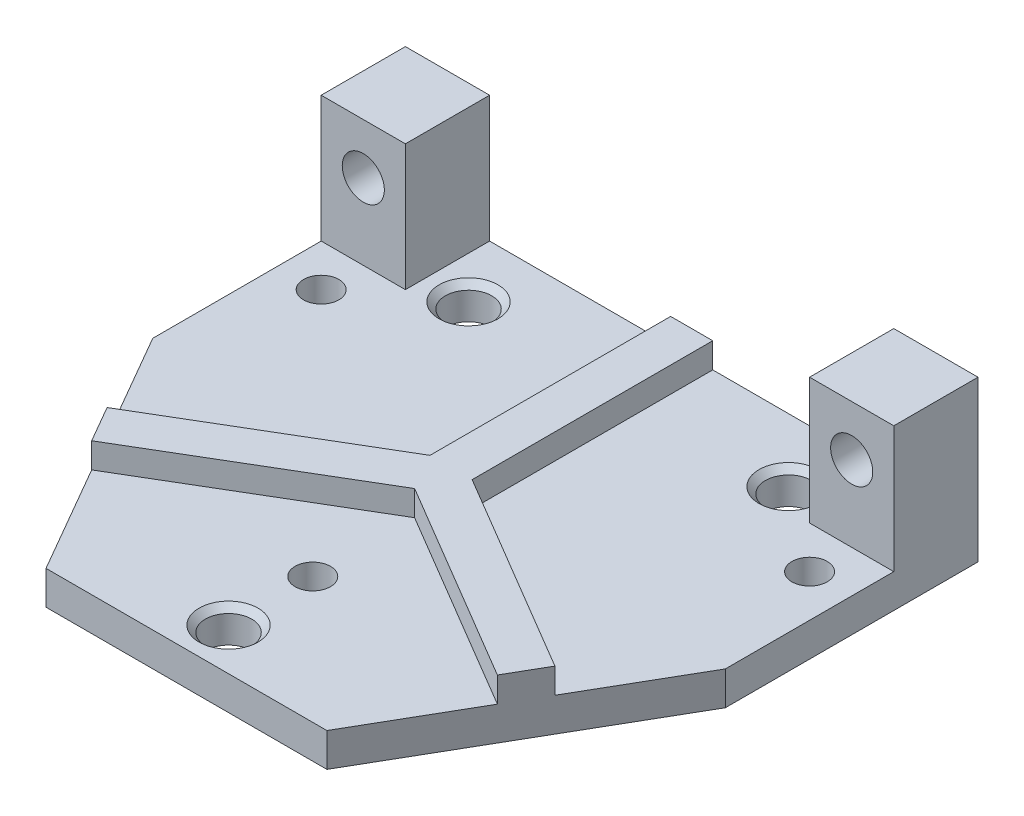
ISO-10303-21;
HEADER;
FILE_DESCRIPTION(('STEP AP214'),'2;1');
FILE_NAME('part.step','',(''),(''),'','','');
FILE_SCHEMA(('AUTOMOTIVE_DESIGN { 1 0 10303 214 1 1 1 1 }'));
ENDSEC;
DATA;
#1=APPLICATION_CONTEXT('core data for automotive mechanical design processes');
#2=APPLICATION_PROTOCOL_DEFINITION('international standard','automotive_design',2000,#1);
#3=PRODUCT_CONTEXT('',#1,'mechanical');
#4=PRODUCT('Part','Part','',(#3));
#5=PRODUCT_RELATED_PRODUCT_CATEGORY('part','',(#4));
#6=PRODUCT_DEFINITION_FORMATION('','',#4);
#7=PRODUCT_DEFINITION_CONTEXT('part definition',#1,'design');
#8=PRODUCT_DEFINITION('design','',#6,#7);
#9=PRODUCT_DEFINITION_SHAPE('','',#8);
#10=(LENGTH_UNIT() NAMED_UNIT(*) SI_UNIT(.MILLI.,.METRE.));
#11=(NAMED_UNIT(*) PLANE_ANGLE_UNIT() SI_UNIT($,.RADIAN.));
#12=(NAMED_UNIT(*) SI_UNIT($,.STERADIAN.) SOLID_ANGLE_UNIT());
#13=UNCERTAINTY_MEASURE_WITH_UNIT(LENGTH_MEASURE(1.E-05),#10,'distance_accuracy_value','');
#14=(GEOMETRIC_REPRESENTATION_CONTEXT(3) GLOBAL_UNCERTAINTY_ASSIGNED_CONTEXT((#13)) GLOBAL_UNIT_ASSIGNED_CONTEXT((#10,
#11,#12)) REPRESENTATION_CONTEXT('',''));
#15=CARTESIAN_POINT('',(0.,0.,0.));
#16=DIRECTION('',(0.,0.,1.));
#17=DIRECTION('',(1.,0.,0.));
#18=AXIS2_PLACEMENT_3D('',#15,#16,#17);
#19=CARTESIAN_POINT('',(0.,4.,0.));
#20=DIRECTION('',(0.,-1.,0.));
#21=DIRECTION('',(0.,0.,-1.));
#22=AXIS2_PLACEMENT_3D('',#19,#20,#21);
#23=PLANE('',#22);
#24=CARTESIAN_POINT('',(19.,4.,-22.5));
#25=DIRECTION('',(0.,-1.,0.));
#26=DIRECTION('',(0.,0.,-1.));
#27=AXIS2_PLACEMENT_3D('',#24,#25,#26);
#28=CIRCLE('',#27,3.5);
#29=CARTESIAN_POINT('',(19.,4.,-26.));
#30=VERTEX_POINT('',#29);
#31=EDGE_CURVE('E11',#30,#30,#28,.T.);
#32=ORIENTED_EDGE('',*,*,#31,.T.);
#33=EDGE_LOOP('',(#32));
#34=FACE_BOUND('',#33,.T.);
#35=CARTESIAN_POINT('',(29.,4.,-15.));
#36=DIRECTION('',(0.,1.,0.));
#37=DIRECTION('',(0.,0.,1.));
#38=AXIS2_PLACEMENT_3D('',#35,#36,#37);
#39=CIRCLE('',#38,2.1);
#40=CARTESIAN_POINT('',(29.,4.,-12.9));
#41=VERTEX_POINT('',#40);
#42=EDGE_CURVE('E314',#41,#41,#39,.T.);
#43=ORIENTED_EDGE('',*,*,#42,.F.);
#44=EDGE_LOOP('',(#43));
#45=FACE_BOUND('',#44,.T.);
#46=DIRECTION('',(0.,0.,1.));
#47=VECTOR('',#46,1.);
#48=CARTESIAN_POINT('',(23.9999999999999,4.,-30.));
#49=LINE('',#48,#47);
#50=CARTESIAN_POINT('',(23.9999999999999,4.,-30.));
#51=VERTEX_POINT('',#50);
#52=CARTESIAN_POINT('',(23.9999999999999,4.,-20.));
#53=VERTEX_POINT('',#52);
#54=EDGE_CURVE('E202',#51,#53,#49,.T.);
#55=ORIENTED_EDGE('',*,*,#54,.F.);
#56=DIRECTION('',(-1.,0.,0.));
#57=VECTOR('',#56,1.);
#58=CARTESIAN_POINT('',(-34.,4.,-30.));
#59=LINE('',#58,#57);
#60=CARTESIAN_POINT('',(2.5,4.,-30.));
#61=VERTEX_POINT('',#60);
#62=EDGE_CURVE('E337',#51,#61,#59,.T.);
#63=ORIENTED_EDGE('',*,*,#62,.T.);
#64=DIRECTION('',(0.,0.,-1.));
#65=VECTOR('',#64,1.);
#66=CARTESIAN_POINT('',(2.5,4.,-1.4252913257079));
#67=LINE('',#66,#65);
#68=CARTESIAN_POINT('',(2.5,4.,-1.4252913257079));
#69=VERTEX_POINT('',#68);
#70=EDGE_CURVE('E276',#69,#61,#67,.T.);
#71=ORIENTED_EDGE('',*,*,#70,.F.);
#72=DIRECTION('',(-0.860531913298751,0.,-0.509396531392186));
#73=VECTOR('',#72,1.);
#74=CARTESIAN_POINT('',(2.5,4.,-1.4252913257079));
#75=LINE('',#74,#73);
#76=CARTESIAN_POINT('',(26.5898200123171,4.,12.834808231897));
#77=VERTEX_POINT('',#76);
#78=EDGE_CURVE('E273',#77,#69,#75,.T.);
#79=ORIENTED_EDGE('',*,*,#78,.F.);
#80=DIRECTION('',(0.499999999999997,0.,-0.86602540378444));
#81=VECTOR('',#80,1.);
#82=CARTESIAN_POINT('',(16.6794919243114,4.,30.));
#83=LINE('',#82,#81);
#84=CARTESIAN_POINT('',(34.,4.,0.));
#85=VERTEX_POINT('',#84);
#86=EDGE_CURVE('E346',#77,#85,#83,.T.);
#87=ORIENTED_EDGE('',*,*,#86,.T.);
#88=DIRECTION('',(0.,0.,-1.));
#89=VECTOR('',#88,1.);
#90=CARTESIAN_POINT('',(34.,4.,0.));
#91=LINE('',#90,#89);
#92=CARTESIAN_POINT('',(34.,4.,-20.));
#93=VERTEX_POINT('',#92);
#94=EDGE_CURVE('E52',#85,#93,#91,.T.);
#95=ORIENTED_EDGE('',*,*,#94,.T.);
#96=DIRECTION('',(1.,0.,0.));
#97=VECTOR('',#96,1.);
#98=CARTESIAN_POINT('',(34.,4.,-20.));
#99=LINE('',#98,#97);
#100=EDGE_CURVE('E47',#53,#93,#99,.T.);
#101=ORIENTED_EDGE('',*,*,#100,.F.);
#102=EDGE_LOOP('',(#55,#63,#71,#79,#87,#95,#101));
#103=FACE_BOUND('',#102,.T.);
#104=ADVANCED_FACE('F32',(#34,#45,#103),#23,.F.);
#105=CARTESIAN_POINT('',(-19.,4.,-22.5));
#106=DIRECTION('',(0.,-1.,0.));
#107=DIRECTION('',(0.,0.,-1.));
#108=AXIS2_PLACEMENT_3D('',#105,#106,#107);
#109=CIRCLE('',#108,3.5);
#110=CARTESIAN_POINT('',(-19.,4.,-26.));
#111=VERTEX_POINT('',#110);
#112=EDGE_CURVE('E386',#111,#111,#109,.T.);
#113=ORIENTED_EDGE('',*,*,#112,.T.);
#114=EDGE_LOOP('',(#113));
#115=FACE_BOUND('',#114,.T.);
#116=CARTESIAN_POINT('',(-29.,4.,-15.));
#117=DIRECTION('',(0.,1.,0.));
#118=DIRECTION('',(0.,0.,1.));
#119=AXIS2_PLACEMENT_3D('',#116,#117,#118);
#120=CIRCLE('',#119,2.1);
#121=CARTESIAN_POINT('',(-29.,4.,-12.9));
#122=VERTEX_POINT('',#121);
#123=EDGE_CURVE('E320',#122,#122,#120,.T.);
#124=ORIENTED_EDGE('',*,*,#123,.F.);
#125=EDGE_LOOP('',(#124));
#126=FACE_BOUND('',#125,.T.);
#127=DIRECTION('',(1.,0.,0.));
#128=VECTOR('',#127,1.);
#129=CARTESIAN_POINT('',(-34.,4.,-20.));
#130=LINE('',#129,#128);
#131=CARTESIAN_POINT('',(-34.,4.,-20.));
#132=VERTEX_POINT('',#131);
#133=CARTESIAN_POINT('',(-24.,4.,-20.));
#134=VERTEX_POINT('',#133);
#135=EDGE_CURVE('E218',#132,#134,#130,.T.);
#136=ORIENTED_EDGE('',*,*,#135,.F.);
#137=DIRECTION('',(0.,0.,1.));
#138=VECTOR('',#137,1.);
#139=CARTESIAN_POINT('',(-34.,4.,0.));
#140=LINE('',#139,#138);
#141=CARTESIAN_POINT('',(-34.,4.,0.));
#142=VERTEX_POINT('',#141);
#143=EDGE_CURVE('E339',#132,#142,#140,.T.);
#144=ORIENTED_EDGE('',*,*,#143,.T.);
#145=DIRECTION('',(0.499999999999999,0.,0.866025403784439));
#146=VECTOR('',#145,1.);
#147=CARTESIAN_POINT('',(-34.,4.,0.));
#148=LINE('',#147,#146);
#149=CARTESIAN_POINT('',(-26.5898200123171,4.,12.834808231897));
#150=VERTEX_POINT('',#149);
#151=EDGE_CURVE('E342',#142,#150,#148,.T.);
#152=ORIENTED_EDGE('',*,*,#151,.T.);
#153=DIRECTION('',(-0.860531913298751,0.,0.509396531392187));
#154=VECTOR('',#153,1.);
#155=CARTESIAN_POINT('',(-26.5898200123171,4.,12.834808231897));
#156=LINE('',#155,#154);
#157=CARTESIAN_POINT('',(-2.5,4.,-1.4252913257079));
#158=VERTEX_POINT('',#157);
#159=EDGE_CURVE('E243',#158,#150,#156,.T.);
#160=ORIENTED_EDGE('',*,*,#159,.F.);
#161=DIRECTION('',(0.,0.,1.));
#162=VECTOR('',#161,1.);
#163=CARTESIAN_POINT('',(-2.5,4.,-1.4252913257079));
#164=LINE('',#163,#162);
#165=CARTESIAN_POINT('',(-2.5,4.,-30.));
#166=VERTEX_POINT('',#165);
#167=EDGE_CURVE('E248',#166,#158,#164,.T.);
#168=ORIENTED_EDGE('',*,*,#167,.F.);
#169=CARTESIAN_POINT('',(-24.,4.,-30.));
#170=VERTEX_POINT('',#169);
#171=EDGE_CURVE('E335',#166,#170,#59,.T.);
#172=ORIENTED_EDGE('',*,*,#171,.T.);
#173=DIRECTION('',(0.,0.,-1.));
#174=VECTOR('',#173,1.);
#175=CARTESIAN_POINT('',(-24.,4.,-30.));
#176=LINE('',#175,#174);
#177=EDGE_CURVE('E223',#134,#170,#176,.T.);
#178=ORIENTED_EDGE('',*,*,#177,.F.);
#179=EDGE_LOOP('',(#136,#144,#152,#160,#168,#172,#178));
#180=FACE_BOUND('',#179,.T.);
#181=ADVANCED_FACE('F404',(#115,#126,#180),#23,.F.);
#182=CARTESIAN_POINT('',(0.,4.,25.));
#183=DIRECTION('',(0.,-1.,0.));
#184=DIRECTION('',(0.,0.,-1.));
#185=AXIS2_PLACEMENT_3D('',#182,#183,#184);
#186=CIRCLE('',#185,3.5);
#187=CARTESIAN_POINT('',(0.,4.,21.5));
#188=VERTEX_POINT('',#187);
#189=EDGE_CURVE('E380',#188,#188,#186,.T.);
#190=ORIENTED_EDGE('',*,*,#189,.T.);
#191=EDGE_LOOP('',(#190));
#192=FACE_BOUND('',#191,.T.);
#193=CARTESIAN_POINT('',(0.,4.,15.));
#194=DIRECTION('',(0.,1.,0.));
#195=DIRECTION('',(0.,0.,1.));
#196=AXIS2_PLACEMENT_3D('',#193,#194,#195);
#197=CIRCLE('',#196,2.1);
#198=CARTESIAN_POINT('',(0.,4.,17.1));
#199=VERTEX_POINT('',#198);
#200=EDGE_CURVE('E308',#199,#199,#197,.T.);
#201=ORIENTED_EDGE('',*,*,#200,.F.);
#202=EDGE_LOOP('',(#201));
#203=FACE_BOUND('',#202,.T.);
#204=DIRECTION('',(0.860531913298751,0.,0.509396531392186));
#205=VECTOR('',#204,1.);
#206=CARTESIAN_POINT('',(0.,4.,2.90517987928714));
#207=LINE('',#206,#205);
#208=CARTESIAN_POINT('',(0.,4.,2.90517987928714));
#209=VERTEX_POINT('',#208);
#210=CARTESIAN_POINT('',(24.0896719119943,4.,17.165191768103));
#211=VERTEX_POINT('',#210);
#212=EDGE_CURVE('E270',#209,#211,#207,.T.);
#213=ORIENTED_EDGE('',*,*,#212,.F.);
#214=DIRECTION('',(0.86053191329875,0.,-0.509396531392187));
#215=VECTOR('',#214,1.);
#216=CARTESIAN_POINT('',(-24.0896719119942,4.,17.165191768103));
#217=LINE('',#216,#215);
#218=CARTESIAN_POINT('',(-24.0896719119942,4.,17.165191768103));
#219=VERTEX_POINT('',#218);
#220=EDGE_CURVE('E267',#219,#209,#217,.T.);
#221=ORIENTED_EDGE('',*,*,#220,.F.);
#222=CARTESIAN_POINT('',(-16.6794919243113,4.,30.));
#223=VERTEX_POINT('',#222);
#224=EDGE_CURVE('E341',#219,#223,#148,.T.);
#225=ORIENTED_EDGE('',*,*,#224,.T.);
#226=DIRECTION('',(1.,0.,0.));
#227=VECTOR('',#226,1.);
#228=CARTESIAN_POINT('',(-16.6794919243113,4.,30.));
#229=LINE('',#228,#227);
#230=CARTESIAN_POINT('',(16.6794919243114,4.,30.));
#231=VERTEX_POINT('',#230);
#232=EDGE_CURVE('E344',#223,#231,#229,.T.);
#233=ORIENTED_EDGE('',*,*,#232,.T.);
#234=EDGE_CURVE('E347',#231,#211,#83,.T.);
#235=ORIENTED_EDGE('',*,*,#234,.T.);
#236=EDGE_LOOP('',(#213,#221,#225,#233,#235));
#237=FACE_BOUND('',#236,.T.);
#238=ADVANCED_FACE('F407',(#192,#203,#237),#23,.F.);
#239=CARTESIAN_POINT('',(0.,0.,0.));
#240=DIRECTION('',(0.,-1.,0.));
#241=DIRECTION('',(0.,0.,-1.));
#242=AXIS2_PLACEMENT_3D('',#239,#240,#241);
#243=PLANE('',#242);
#244=CARTESIAN_POINT('',(29.,0.,-15.));
#245=DIRECTION('',(0.,1.,0.));
#246=DIRECTION('',(0.,0.,1.));
#247=AXIS2_PLACEMENT_3D('',#244,#245,#246);
#248=CIRCLE('',#247,2.1);
#249=CARTESIAN_POINT('',(29.,0.,-12.9));
#250=VERTEX_POINT('',#249);
#251=EDGE_CURVE('E311',#250,#250,#248,.T.);
#252=ORIENTED_EDGE('',*,*,#251,.T.);
#253=EDGE_LOOP('',(#252));
#254=FACE_BOUND('',#253,.T.);
#255=CARTESIAN_POINT('',(0.,0.,25.));
#256=DIRECTION('',(0.,1.,0.));
#257=DIRECTION('',(0.,0.,1.));
#258=AXIS2_PLACEMENT_3D('',#255,#256,#257);
#259=CIRCLE('',#258,2.75);
#260=CARTESIAN_POINT('',(0.,0.,27.75));
#261=VERTEX_POINT('',#260);
#262=EDGE_CURVE('E323',#261,#261,#259,.T.);
#263=ORIENTED_EDGE('',*,*,#262,.T.);
#264=EDGE_LOOP('',(#263));
#265=FACE_BOUND('',#264,.T.);
#266=CARTESIAN_POINT('',(-19.,0.,-22.5));
#267=DIRECTION('',(0.,1.,0.));
#268=DIRECTION('',(0.,0.,1.));
#269=AXIS2_PLACEMENT_3D('',#266,#267,#268);
#270=CIRCLE('',#269,2.75);
#271=CARTESIAN_POINT('',(-19.,0.,-19.75));
#272=VERTEX_POINT('',#271);
#273=EDGE_CURVE('E331',#272,#272,#270,.T.);
#274=ORIENTED_EDGE('',*,*,#273,.T.);
#275=EDGE_LOOP('',(#274));
#276=FACE_BOUND('',#275,.T.);
#277=DIRECTION('',(0.,0.,-1.));
#278=VECTOR('',#277,1.);
#279=CARTESIAN_POINT('',(34.,0.,0.));
#280=LINE('',#279,#278);
#281=CARTESIAN_POINT('',(34.,0.,0.));
#282=VERTEX_POINT('',#281);
#283=CARTESIAN_POINT('',(34.,0.,-30.));
#284=VERTEX_POINT('',#283);
#285=EDGE_CURVE('E183',#282,#284,#280,.T.);
#286=ORIENTED_EDGE('',*,*,#285,.F.);
#287=DIRECTION('',(0.499999999999997,0.,-0.86602540378444));
#288=VECTOR('',#287,1.);
#289=CARTESIAN_POINT('',(16.6794919243114,0.,30.));
#290=LINE('',#289,#288);
#291=CARTESIAN_POINT('',(16.6794919243114,0.,30.));
#292=VERTEX_POINT('',#291);
#293=EDGE_CURVE('E336',#292,#282,#290,.T.);
#294=ORIENTED_EDGE('',*,*,#293,.F.);
#295=DIRECTION('',(1.,0.,0.));
#296=VECTOR('',#295,1.);
#297=CARTESIAN_POINT('',(-16.6794919243113,0.,30.));
#298=LINE('',#297,#296);
#299=CARTESIAN_POINT('',(-16.6794919243113,0.,30.));
#300=VERTEX_POINT('',#299);
#301=EDGE_CURVE('E357',#300,#292,#298,.T.);
#302=ORIENTED_EDGE('',*,*,#301,.F.);
#303=DIRECTION('',(0.499999999999999,0.,0.866025403784439));
#304=VECTOR('',#303,1.);
#305=CARTESIAN_POINT('',(-34.,0.,0.));
#306=LINE('',#305,#304);
#307=CARTESIAN_POINT('',(-34.,0.,0.));
#308=VERTEX_POINT('',#307);
#309=EDGE_CURVE('E355',#308,#300,#306,.T.);
#310=ORIENTED_EDGE('',*,*,#309,.F.);
#311=DIRECTION('',(0.,0.,1.));
#312=VECTOR('',#311,1.);
#313=CARTESIAN_POINT('',(-34.,0.,0.));
#314=LINE('',#313,#312);
#315=CARTESIAN_POINT('',(-34.,0.,-30.));
#316=VERTEX_POINT('',#315);
#317=EDGE_CURVE('E353',#316,#308,#314,.T.);
#318=ORIENTED_EDGE('',*,*,#317,.F.);
#319=DIRECTION('',(-1.,0.,0.));
#320=VECTOR('',#319,1.);
#321=CARTESIAN_POINT('',(-34.,0.,-30.));
#322=LINE('',#321,#320);
#323=EDGE_CURVE('E351',#284,#316,#322,.T.);
#324=ORIENTED_EDGE('',*,*,#323,.F.);
#325=EDGE_LOOP('',(#286,#294,#302,#310,#318,#324));
#326=FACE_BOUND('',#325,.T.);
#327=CARTESIAN_POINT('',(19.,0.,-22.5));
#328=DIRECTION('',(0.,1.,0.));
#329=DIRECTION('',(0.,0.,1.));
#330=AXIS2_PLACEMENT_3D('',#327,#328,#329);
#331=CIRCLE('',#330,2.75);
#332=CARTESIAN_POINT('',(19.,0.,-19.75));
#333=VERTEX_POINT('',#332);
#334=EDGE_CURVE('E328',#333,#333,#331,.T.);
#335=ORIENTED_EDGE('',*,*,#334,.T.);
#336=EDGE_LOOP('',(#335));
#337=FACE_BOUND('',#336,.T.);
#338=CARTESIAN_POINT('',(-29.,0.,-15.));
#339=DIRECTION('',(0.,1.,0.));
#340=DIRECTION('',(0.,0.,1.));
#341=AXIS2_PLACEMENT_3D('',#338,#339,#340);
#342=CIRCLE('',#341,2.1);
#343=CARTESIAN_POINT('',(-29.,0.,-12.9));
#344=VERTEX_POINT('',#343);
#345=EDGE_CURVE('E317',#344,#344,#342,.T.);
#346=ORIENTED_EDGE('',*,*,#345,.T.);
#347=EDGE_LOOP('',(#346));
#348=FACE_BOUND('',#347,.T.);
#349=CARTESIAN_POINT('',(0.,0.,15.));
#350=DIRECTION('',(0.,1.,0.));
#351=DIRECTION('',(0.,0.,1.));
#352=AXIS2_PLACEMENT_3D('',#349,#350,#351);
#353=CIRCLE('',#352,2.1);
#354=CARTESIAN_POINT('',(0.,0.,17.1));
#355=VERTEX_POINT('',#354);
#356=EDGE_CURVE('E307',#355,#355,#353,.T.);
#357=ORIENTED_EDGE('',*,*,#356,.T.);
#358=EDGE_LOOP('',(#357));
#359=FACE_BOUND('',#358,.T.);
#360=ADVANCED_FACE('F416',(#254,#265,#276,#326,#337,#348,#359),#243,.T.);
#361=CARTESIAN_POINT('',(34.,4.,0.));
#362=DIRECTION('',(-1.,0.,0.));
#363=DIRECTION('',(0.,0.,1.));
#364=AXIS2_PLACEMENT_3D('',#361,#362,#363);
#365=PLANE('',#364);
#366=ORIENTED_EDGE('',*,*,#285,.T.);
#367=DIRECTION('',(0.,-1.,0.));
#368=VECTOR('',#367,1.);
#369=CARTESIAN_POINT('',(34.,4.,-30.));
#370=LINE('',#369,#368);
#371=CARTESIAN_POINT('',(34.,19.,-30.));
#372=VERTEX_POINT('',#371);
#373=EDGE_CURVE('E175',#372,#284,#370,.T.);
#374=ORIENTED_EDGE('',*,*,#373,.F.);
#375=DIRECTION('',(0.,0.,-1.));
#376=VECTOR('',#375,1.);
#377=CARTESIAN_POINT('',(34.,19.,-30.));
#378=LINE('',#377,#376);
#379=CARTESIAN_POINT('',(34.,19.,-20.));
#380=VERTEX_POINT('',#379);
#381=EDGE_CURVE('E180',#380,#372,#378,.T.);
#382=ORIENTED_EDGE('',*,*,#381,.F.);
#383=DIRECTION('',(0.,-1.,0.));
#384=VECTOR('',#383,1.);
#385=CARTESIAN_POINT('',(34.,19.,-20.));
#386=LINE('',#385,#384);
#387=EDGE_CURVE('E210',#380,#93,#386,.T.);
#388=ORIENTED_EDGE('',*,*,#387,.T.);
#389=ORIENTED_EDGE('',*,*,#94,.F.);
#390=DIRECTION('',(0.,-1.,0.));
#391=VECTOR('',#390,1.);
#392=CARTESIAN_POINT('',(34.,4.,0.));
#393=LINE('',#392,#391);
#394=EDGE_CURVE('E349',#85,#282,#393,.T.);
#395=ORIENTED_EDGE('',*,*,#394,.T.);
#396=EDGE_LOOP('',(#366,#374,#382,#388,#389,#395));
#397=FACE_BOUND('',#396,.T.);
#398=ADVANCED_FACE('F177',(#397),#365,.F.);
#399=CARTESIAN_POINT('',(-34.,4.,-30.));
#400=DIRECTION('',(0.,0.,1.));
#401=DIRECTION('',(1.,0.,0.));
#402=AXIS2_PLACEMENT_3D('',#399,#400,#401);
#403=PLANE('',#402);
#404=CARTESIAN_POINT('',(29.,13.,-30.));
#405=DIRECTION('',(0.,0.,-1.));
#406=DIRECTION('',(-1.,0.,0.));
#407=AXIS2_PLACEMENT_3D('',#404,#405,#406);
#408=CIRCLE('',#407,2.5);
#409=CARTESIAN_POINT('',(26.5,13.,-30.));
#410=VERTEX_POINT('',#409);
#411=EDGE_CURVE('E375',#410,#410,#408,.T.);
#412=ORIENTED_EDGE('',*,*,#411,.F.);
#413=EDGE_LOOP('',(#412));
#414=FACE_BOUND('',#413,.T.);
#415=CARTESIAN_POINT('',(-29.,13.,-30.));
#416=DIRECTION('',(0.,0.,-1.));
#417=DIRECTION('',(-1.,0.,0.));
#418=AXIS2_PLACEMENT_3D('',#415,#416,#417);
#419=CIRCLE('',#418,2.49999999999999);
#420=CARTESIAN_POINT('',(-31.5,13.,-30.));
#421=VERTEX_POINT('',#420);
#422=EDGE_CURVE('E205',#421,#421,#419,.T.);
#423=ORIENTED_EDGE('',*,*,#422,.F.);
#424=EDGE_LOOP('',(#423));
#425=FACE_BOUND('',#424,.T.);
#426=ORIENTED_EDGE('',*,*,#323,.T.);
#427=DIRECTION('',(0.,-1.,0.));
#428=VECTOR('',#427,1.);
#429=CARTESIAN_POINT('',(-34.,4.,-30.));
#430=LINE('',#429,#428);
#431=CARTESIAN_POINT('',(-34.,19.,-30.));
#432=VERTEX_POINT('',#431);
#433=EDGE_CURVE('E186',#432,#316,#430,.T.);
#434=ORIENTED_EDGE('',*,*,#433,.F.);
#435=DIRECTION('',(-1.,0.,0.));
#436=VECTOR('',#435,1.);
#437=CARTESIAN_POINT('',(-34.,19.,-30.));
#438=LINE('',#437,#436);
#439=CARTESIAN_POINT('',(-24.,19.,-30.));
#440=VERTEX_POINT('',#439);
#441=EDGE_CURVE('E227',#440,#432,#438,.T.);
#442=ORIENTED_EDGE('',*,*,#441,.F.);
#443=DIRECTION('',(0.,-1.,0.));
#444=VECTOR('',#443,1.);
#445=CARTESIAN_POINT('',(-24.,19.,-30.));
#446=LINE('',#445,#444);
#447=EDGE_CURVE('E230',#440,#170,#446,.T.);
#448=ORIENTED_EDGE('',*,*,#447,.T.);
#449=ORIENTED_EDGE('',*,*,#171,.F.);
#450=DIRECTION('',(0.,-1.,0.));
#451=VECTOR('',#450,1.);
#452=CARTESIAN_POINT('',(-2.5,7.,-30.));
#453=LINE('',#452,#451);
#454=CARTESIAN_POINT('',(-2.5,7.,-30.));
#455=VERTEX_POINT('',#454);
#456=EDGE_CURVE('E283',#455,#166,#453,.T.);
#457=ORIENTED_EDGE('',*,*,#456,.F.);
#458=DIRECTION('',(-1.,0.,0.));
#459=VECTOR('',#458,1.);
#460=CARTESIAN_POINT('',(-2.5,7.,-30.));
#461=LINE('',#460,#459);
#462=CARTESIAN_POINT('',(2.5,7.,-30.));
#463=VERTEX_POINT('',#462);
#464=EDGE_CURVE('E260',#463,#455,#461,.T.);
#465=ORIENTED_EDGE('',*,*,#464,.F.);
#466=DIRECTION('',(0.,-1.,0.));
#467=VECTOR('',#466,1.);
#468=CARTESIAN_POINT('',(2.5,7.,-30.));
#469=LINE('',#468,#467);
#470=EDGE_CURVE('E286',#463,#61,#469,.T.);
#471=ORIENTED_EDGE('',*,*,#470,.T.);
#472=ORIENTED_EDGE('',*,*,#62,.F.);
#473=DIRECTION('',(0.,-1.,0.));
#474=VECTOR('',#473,1.);
#475=CARTESIAN_POINT('',(23.9999999999999,19.,-30.));
#476=LINE('',#475,#474);
#477=CARTESIAN_POINT('',(23.9999999999999,19.,-30.));
#478=VERTEX_POINT('',#477);
#479=EDGE_CURVE('E192',#478,#51,#476,.T.);
#480=ORIENTED_EDGE('',*,*,#479,.F.);
#481=DIRECTION('',(-1.,0.,0.));
#482=VECTOR('',#481,1.);
#483=CARTESIAN_POINT('',(34.,19.,-30.));
#484=LINE('',#483,#482);
#485=EDGE_CURVE('E189',#372,#478,#484,.T.);
#486=ORIENTED_EDGE('',*,*,#485,.F.);
#487=ORIENTED_EDGE('',*,*,#373,.T.);
#488=EDGE_LOOP('',(#426,#434,#442,#448,#449,#457,#465,#471,#472,#480,#486,#487));
#489=FACE_BOUND('',#488,.T.);
#490=ADVANCED_FACE('F190',(#414,#425,#489),#403,.F.);
#491=CARTESIAN_POINT('',(-34.,4.,0.));
#492=DIRECTION('',(1.,0.,0.));
#493=DIRECTION('',(0.,0.,-1.));
#494=AXIS2_PLACEMENT_3D('',#491,#492,#493);
#495=PLANE('',#494);
#496=ORIENTED_EDGE('',*,*,#317,.T.);
#497=DIRECTION('',(0.,-1.,0.));
#498=VECTOR('',#497,1.);
#499=CARTESIAN_POINT('',(-34.,4.,0.));
#500=LINE('',#499,#498);
#501=EDGE_CURVE('E367',#142,#308,#500,.T.);
#502=ORIENTED_EDGE('',*,*,#501,.F.);
#503=ORIENTED_EDGE('',*,*,#143,.F.);
#504=DIRECTION('',(0.,-1.,0.));
#505=VECTOR('',#504,1.);
#506=CARTESIAN_POINT('',(-34.,19.,-20.));
#507=LINE('',#506,#505);
#508=CARTESIAN_POINT('',(-34.,19.,-20.));
#509=VERTEX_POINT('',#508);
#510=EDGE_CURVE('E240',#509,#132,#507,.T.);
#511=ORIENTED_EDGE('',*,*,#510,.F.);
#512=DIRECTION('',(0.,0.,1.));
#513=VECTOR('',#512,1.);
#514=CARTESIAN_POINT('',(-34.,19.,-30.));
#515=LINE('',#514,#513);
#516=EDGE_CURVE('E219',#432,#509,#515,.T.);
#517=ORIENTED_EDGE('',*,*,#516,.F.);
#518=ORIENTED_EDGE('',*,*,#433,.T.);
#519=EDGE_LOOP('',(#496,#502,#503,#511,#517,#518));
#520=FACE_BOUND('',#519,.T.);
#521=ADVANCED_FACE('F480',(#520),#495,.F.);
#522=CARTESIAN_POINT('',(-34.,4.,0.));
#523=DIRECTION('',(0.866025403784439,0.,-0.499999999999999));
#524=DIRECTION('',(-0.499999999999999,0.,-0.866025403784439));
#525=AXIS2_PLACEMENT_3D('',#522,#523,#524);
#526=PLANE('',#525);
#527=ORIENTED_EDGE('',*,*,#309,.T.);
#528=DIRECTION('',(0.,-1.,0.));
#529=VECTOR('',#528,1.);
#530=CARTESIAN_POINT('',(-16.6794919243113,4.,30.));
#531=LINE('',#530,#529);
#532=EDGE_CURVE('E364',#223,#300,#531,.T.);
#533=ORIENTED_EDGE('',*,*,#532,.F.);
#534=ORIENTED_EDGE('',*,*,#224,.F.);
#535=DIRECTION('',(0.,-1.,0.));
#536=VECTOR('',#535,1.);
#537=CARTESIAN_POINT('',(-24.0896719119942,7.,17.165191768103));
#538=LINE('',#537,#536);
#539=CARTESIAN_POINT('',(-24.0896719119942,7.,17.165191768103));
#540=VERTEX_POINT('',#539);
#541=EDGE_CURVE('E301',#540,#219,#538,.T.);
#542=ORIENTED_EDGE('',*,*,#541,.F.);
#543=DIRECTION('',(0.499999999999999,0.,0.866025403784439));
#544=VECTOR('',#543,1.);
#545=CARTESIAN_POINT('',(-26.5898200123171,7.,12.834808231897));
#546=LINE('',#545,#544);
#547=CARTESIAN_POINT('',(-26.5898200123171,7.,12.834808231897));
#548=VERTEX_POINT('',#547);
#549=EDGE_CURVE('E247',#548,#540,#546,.T.);
#550=ORIENTED_EDGE('',*,*,#549,.F.);
#551=DIRECTION('',(0.,-1.,0.));
#552=VECTOR('',#551,1.);
#553=CARTESIAN_POINT('',(-26.5898200123171,7.,12.834808231897));
#554=LINE('',#553,#552);
#555=EDGE_CURVE('E304',#548,#150,#554,.T.);
#556=ORIENTED_EDGE('',*,*,#555,.T.);
#557=ORIENTED_EDGE('',*,*,#151,.F.);
#558=ORIENTED_EDGE('',*,*,#501,.T.);
#559=EDGE_LOOP('',(#527,#533,#534,#542,#550,#556,#557,#558));
#560=FACE_BOUND('',#559,.T.);
#561=ADVANCED_FACE('F444',(#560),#526,.F.);
#562=CARTESIAN_POINT('',(-16.6794919243113,4.,30.));
#563=DIRECTION('',(0.,0.,-1.));
#564=DIRECTION('',(-1.,0.,0.));
#565=AXIS2_PLACEMENT_3D('',#562,#563,#564);
#566=PLANE('',#565);
#567=ORIENTED_EDGE('',*,*,#301,.T.);
#568=DIRECTION('',(0.,-1.,0.));
#569=VECTOR('',#568,1.);
#570=CARTESIAN_POINT('',(16.6794919243114,4.,30.));
#571=LINE('',#570,#569);
#572=EDGE_CURVE('E361',#231,#292,#571,.T.);
#573=ORIENTED_EDGE('',*,*,#572,.F.);
#574=ORIENTED_EDGE('',*,*,#232,.F.);
#575=ORIENTED_EDGE('',*,*,#532,.T.);
#576=EDGE_LOOP('',(#567,#573,#574,#575));
#577=FACE_BOUND('',#576,.T.);
#578=ADVANCED_FACE('F449',(#577),#566,.F.);
#579=CARTESIAN_POINT('',(16.6794919243114,4.,30.));
#580=DIRECTION('',(-0.86602540378444,0.,-0.499999999999997));
#581=DIRECTION('',(-0.499999999999997,0.,0.86602540378444));
#582=AXIS2_PLACEMENT_3D('',#579,#580,#581);
#583=PLANE('',#582);
#584=ORIENTED_EDGE('',*,*,#293,.T.);
#585=ORIENTED_EDGE('',*,*,#394,.F.);
#586=ORIENTED_EDGE('',*,*,#86,.F.);
#587=DIRECTION('',(0.,-1.,0.));
#588=VECTOR('',#587,1.);
#589=CARTESIAN_POINT('',(26.5898200123171,7.,12.834808231897));
#590=LINE('',#589,#588);
#591=CARTESIAN_POINT('',(26.5898200123171,7.,12.834808231897));
#592=VERTEX_POINT('',#591);
#593=EDGE_CURVE('E292',#592,#77,#590,.T.);
#594=ORIENTED_EDGE('',*,*,#593,.F.);
#595=DIRECTION('',(0.499999999999997,0.,-0.866025403784441));
#596=VECTOR('',#595,1.);
#597=CARTESIAN_POINT('',(24.0896719119943,7.,17.165191768103));
#598=LINE('',#597,#596);
#599=CARTESIAN_POINT('',(24.0896719119943,7.,17.165191768103));
#600=VERTEX_POINT('',#599);
#601=EDGE_CURVE('E254',#600,#592,#598,.T.);
#602=ORIENTED_EDGE('',*,*,#601,.F.);
#603=DIRECTION('',(0.,-1.,0.));
#604=VECTOR('',#603,1.);
#605=CARTESIAN_POINT('',(24.0896719119943,7.,17.165191768103));
#606=LINE('',#605,#604);
#607=EDGE_CURVE('E295',#600,#211,#606,.T.);
#608=ORIENTED_EDGE('',*,*,#607,.T.);
#609=ORIENTED_EDGE('',*,*,#234,.F.);
#610=ORIENTED_EDGE('',*,*,#572,.T.);
#611=EDGE_LOOP('',(#584,#585,#586,#594,#602,#608,#609,#610));
#612=FACE_BOUND('',#611,.T.);
#613=ADVANCED_FACE('F453',(#612),#583,.F.);
#614=CARTESIAN_POINT('',(-19.,4.,-22.5));
#615=DIRECTION('',(0.,-1.,0.));
#616=DIRECTION('',(0.,0.,-1.));
#617=AXIS2_PLACEMENT_3D('',#614,#615,#616);
#618=CYLINDRICAL_SURFACE('',#617,2.75);
#619=CARTESIAN_POINT('',(-19.,3.25,-22.5));
#620=DIRECTION('',(0.,-1.,0.));
#621=DIRECTION('',(0.,0.,-1.));
#622=AXIS2_PLACEMENT_3D('',#619,#620,#621);
#623=CIRCLE('',#622,2.75);
#624=CARTESIAN_POINT('',(-19.,3.25,-25.25));
#625=VERTEX_POINT('',#624);
#626=EDGE_CURVE('E383',#625,#625,#623,.F.);
#627=ORIENTED_EDGE('',*,*,#626,.T.);
#628=EDGE_LOOP('',(#627));
#629=FACE_BOUND('',#628,.T.);
#630=ORIENTED_EDGE('',*,*,#273,.F.);
#631=EDGE_LOOP('',(#630));
#632=FACE_BOUND('',#631,.T.);
#633=ADVANCED_FACE('F542',(#629,#632),#618,.F.);
#634=CARTESIAN_POINT('',(19.,4.,-22.5));
#635=DIRECTION('',(0.,-1.,0.));
#636=DIRECTION('',(0.,0.,-1.));
#637=AXIS2_PLACEMENT_3D('',#634,#635,#636);
#638=CYLINDRICAL_SURFACE('',#637,2.75);
#639=CARTESIAN_POINT('',(19.,3.25,-22.5));
#640=DIRECTION('',(0.,-1.,0.));
#641=DIRECTION('',(0.,0.,-1.));
#642=AXIS2_PLACEMENT_3D('',#639,#640,#641);
#643=CIRCLE('',#642,2.75);
#644=CARTESIAN_POINT('',(19.,3.25,-25.25));
#645=VERTEX_POINT('',#644);
#646=EDGE_CURVE('E40',#645,#645,#643,.F.);
#647=ORIENTED_EDGE('',*,*,#646,.T.);
#648=EDGE_LOOP('',(#647));
#649=FACE_BOUND('',#648,.T.);
#650=ORIENTED_EDGE('',*,*,#334,.F.);
#651=EDGE_LOOP('',(#650));
#652=FACE_BOUND('',#651,.T.);
#653=ADVANCED_FACE('F391',(#649,#652),#638,.F.);
#654=CARTESIAN_POINT('',(0.,4.,25.));
#655=DIRECTION('',(0.,-1.,0.));
#656=DIRECTION('',(0.,0.,-1.));
#657=AXIS2_PLACEMENT_3D('',#654,#655,#656);
#658=CYLINDRICAL_SURFACE('',#657,2.75);
#659=CARTESIAN_POINT('',(0.,3.25,25.));
#660=DIRECTION('',(0.,-1.,0.));
#661=DIRECTION('',(0.,0.,-1.));
#662=AXIS2_PLACEMENT_3D('',#659,#660,#661);
#663=CIRCLE('',#662,2.75);
#664=CARTESIAN_POINT('',(0.,3.25,22.25));
#665=VERTEX_POINT('',#664);
#666=EDGE_CURVE('E185',#665,#665,#663,.F.);
#667=ORIENTED_EDGE('',*,*,#666,.T.);
#668=EDGE_LOOP('',(#667));
#669=FACE_BOUND('',#668,.T.);
#670=ORIENTED_EDGE('',*,*,#262,.F.);
#671=EDGE_LOOP('',(#670));
#672=FACE_BOUND('',#671,.T.);
#673=ADVANCED_FACE('F536',(#669,#672),#658,.F.);
#674=CARTESIAN_POINT('',(-29.,4.,-15.));
#675=DIRECTION('',(0.,-1.,0.));
#676=DIRECTION('',(0.,0.,-1.));
#677=AXIS2_PLACEMENT_3D('',#674,#675,#676);
#678=CYLINDRICAL_SURFACE('',#677,2.1);
#679=ORIENTED_EDGE('',*,*,#123,.T.);
#680=EDGE_LOOP('',(#679));
#681=FACE_BOUND('',#680,.T.);
#682=ORIENTED_EDGE('',*,*,#345,.F.);
#683=EDGE_LOOP('',(#682));
#684=FACE_BOUND('',#683,.T.);
#685=ADVANCED_FACE('F532',(#681,#684),#678,.F.);
#686=CARTESIAN_POINT('',(29.,4.,-15.));
#687=DIRECTION('',(0.,-1.,0.));
#688=DIRECTION('',(0.,0.,-1.));
#689=AXIS2_PLACEMENT_3D('',#686,#687,#688);
#690=CYLINDRICAL_SURFACE('',#689,2.1);
#691=ORIENTED_EDGE('',*,*,#42,.T.);
#692=EDGE_LOOP('',(#691));
#693=FACE_BOUND('',#692,.T.);
#694=ORIENTED_EDGE('',*,*,#251,.F.);
#695=EDGE_LOOP('',(#694));
#696=FACE_BOUND('',#695,.T.);
#697=ADVANCED_FACE('F528',(#693,#696),#690,.F.);
#698=CARTESIAN_POINT('',(0.,4.,15.));
#699=DIRECTION('',(0.,-1.,0.));
#700=DIRECTION('',(0.,0.,-1.));
#701=AXIS2_PLACEMENT_3D('',#698,#699,#700);
#702=CYLINDRICAL_SURFACE('',#701,2.1);
#703=ORIENTED_EDGE('',*,*,#200,.T.);
#704=EDGE_LOOP('',(#703));
#705=FACE_BOUND('',#704,.T.);
#706=ORIENTED_EDGE('',*,*,#356,.F.);
#707=EDGE_LOOP('',(#706));
#708=FACE_BOUND('',#707,.T.);
#709=ADVANCED_FACE('F525',(#705,#708),#702,.F.);
#710=CARTESIAN_POINT('',(-26.5898200123171,7.,12.834808231897));
#711=DIRECTION('',(0.509396531392187,0.,0.86053191329875));
#712=DIRECTION('',(0.860531913298751,0.,-0.509396531392187));
#713=AXIS2_PLACEMENT_3D('',#710,#711,#712);
#714=PLANE('',#713);
#715=ORIENTED_EDGE('',*,*,#159,.T.);
#716=ORIENTED_EDGE('',*,*,#555,.F.);
#717=DIRECTION('',(-0.860531913298751,0.,0.509396531392187));
#718=VECTOR('',#717,1.);
#719=CARTESIAN_POINT('',(-26.5898200123171,7.,12.834808231897));
#720=LINE('',#719,#718);
#721=CARTESIAN_POINT('',(-2.5,7.,-1.4252913257079));
#722=VERTEX_POINT('',#721);
#723=EDGE_CURVE('E244',#722,#548,#720,.T.);
#724=ORIENTED_EDGE('',*,*,#723,.F.);
#725=DIRECTION('',(0.,-1.,0.));
#726=VECTOR('',#725,1.);
#727=CARTESIAN_POINT('',(-2.5,7.,-1.4252913257079));
#728=LINE('',#727,#726);
#729=EDGE_CURVE('E264',#722,#158,#728,.T.);
#730=ORIENTED_EDGE('',*,*,#729,.T.);
#731=EDGE_LOOP('',(#715,#716,#724,#730));
#732=FACE_BOUND('',#731,.T.);
#733=ADVANCED_FACE('F472',(#732),#714,.F.);
#734=CARTESIAN_POINT('',(-24.0896719119942,7.,17.165191768103));
#735=DIRECTION('',(-0.509396531392187,0.,-0.860531913298751));
#736=DIRECTION('',(-0.860531913298751,0.,0.509396531392187));
#737=AXIS2_PLACEMENT_3D('',#734,#735,#736);
#738=PLANE('',#737);
#739=ORIENTED_EDGE('',*,*,#220,.T.);
#740=DIRECTION('',(0.,-1.,0.));
#741=VECTOR('',#740,1.);
#742=CARTESIAN_POINT('',(0.,7.,2.90517987928714));
#743=LINE('',#742,#741);
#744=CARTESIAN_POINT('',(0.,7.,2.90517987928714));
#745=VERTEX_POINT('',#744);
#746=EDGE_CURVE('E298',#745,#209,#743,.T.);
#747=ORIENTED_EDGE('',*,*,#746,.F.);
#748=DIRECTION('',(0.86053191329875,0.,-0.509396531392187));
#749=VECTOR('',#748,1.);
#750=CARTESIAN_POINT('',(-24.0896719119942,7.,17.165191768103));
#751=LINE('',#750,#749);
#752=EDGE_CURVE('E250',#540,#745,#751,.T.);
#753=ORIENTED_EDGE('',*,*,#752,.F.);
#754=ORIENTED_EDGE('',*,*,#541,.T.);
#755=EDGE_LOOP('',(#739,#747,#753,#754));
#756=FACE_BOUND('',#755,.T.);
#757=ADVANCED_FACE('F432',(#756),#738,.F.);
#758=CARTESIAN_POINT('',(0.,7.,2.90517987928714));
#759=DIRECTION('',(0.509396531392186,0.,-0.860531913298751));
#760=DIRECTION('',(-0.860531913298751,0.,-0.509396531392186));
#761=AXIS2_PLACEMENT_3D('',#758,#759,#760);
#762=PLANE('',#761);
#763=ORIENTED_EDGE('',*,*,#212,.T.);
#764=ORIENTED_EDGE('',*,*,#607,.F.);
#765=DIRECTION('',(0.860531913298751,0.,0.509396531392186));
#766=VECTOR('',#765,1.);
#767=CARTESIAN_POINT('',(0.,7.,2.90517987928714));
#768=LINE('',#767,#766);
#769=EDGE_CURVE('E252',#745,#600,#768,.T.);
#770=ORIENTED_EDGE('',*,*,#769,.F.);
#771=ORIENTED_EDGE('',*,*,#746,.T.);
#772=EDGE_LOOP('',(#763,#764,#770,#771));
#773=FACE_BOUND('',#772,.T.);
#774=ADVANCED_FACE('F436',(#773),#762,.F.);
#775=CARTESIAN_POINT('',(2.5,7.,-1.4252913257079));
#776=DIRECTION('',(-0.509396531392186,0.,0.860531913298751));
#777=DIRECTION('',(0.860531913298751,0.,0.509396531392186));
#778=AXIS2_PLACEMENT_3D('',#775,#776,#777);
#779=PLANE('',#778);
#780=ORIENTED_EDGE('',*,*,#78,.T.);
#781=DIRECTION('',(0.,-1.,0.));
#782=VECTOR('',#781,1.);
#783=CARTESIAN_POINT('',(2.5,7.,-1.4252913257079));
#784=LINE('',#783,#782);
#785=CARTESIAN_POINT('',(2.5,7.,-1.4252913257079));
#786=VERTEX_POINT('',#785);
#787=EDGE_CURVE('E289',#786,#69,#784,.T.);
#788=ORIENTED_EDGE('',*,*,#787,.F.);
#789=DIRECTION('',(-0.860531913298751,0.,-0.509396531392186));
#790=VECTOR('',#789,1.);
#791=CARTESIAN_POINT('',(2.5,7.,-1.4252913257079));
#792=LINE('',#791,#790);
#793=EDGE_CURVE('E256',#592,#786,#792,.T.);
#794=ORIENTED_EDGE('',*,*,#793,.F.);
#795=ORIENTED_EDGE('',*,*,#593,.T.);
#796=EDGE_LOOP('',(#780,#788,#794,#795));
#797=FACE_BOUND('',#796,.T.);
#798=ADVANCED_FACE('F459',(#797),#779,.F.);
#799=CARTESIAN_POINT('',(2.5,7.,-1.4252913257079));
#800=DIRECTION('',(-1.,0.,0.));
#801=DIRECTION('',(0.,0.,1.));
#802=AXIS2_PLACEMENT_3D('',#799,#800,#801);
#803=PLANE('',#802);
#804=ORIENTED_EDGE('',*,*,#70,.T.);
#805=ORIENTED_EDGE('',*,*,#470,.F.);
#806=DIRECTION('',(0.,0.,-1.));
#807=VECTOR('',#806,1.);
#808=CARTESIAN_POINT('',(2.5,7.,-1.4252913257079));
#809=LINE('',#808,#807);
#810=EDGE_CURVE('E258',#786,#463,#809,.T.);
#811=ORIENTED_EDGE('',*,*,#810,.F.);
#812=ORIENTED_EDGE('',*,*,#787,.T.);
#813=EDGE_LOOP('',(#804,#805,#811,#812));
#814=FACE_BOUND('',#813,.T.);
#815=ADVANCED_FACE('F465',(#814),#803,.F.);
#816=CARTESIAN_POINT('',(-2.5,7.,-1.4252913257079));
#817=DIRECTION('',(1.,0.,0.));
#818=DIRECTION('',(0.,0.,-1.));
#819=AXIS2_PLACEMENT_3D('',#816,#817,#818);
#820=PLANE('',#819);
#821=ORIENTED_EDGE('',*,*,#167,.T.);
#822=ORIENTED_EDGE('',*,*,#729,.F.);
#823=DIRECTION('',(0.,0.,1.));
#824=VECTOR('',#823,1.);
#825=CARTESIAN_POINT('',(-2.5,7.,-1.4252913257079));
#826=LINE('',#825,#824);
#827=EDGE_CURVE('E262',#455,#722,#826,.T.);
#828=ORIENTED_EDGE('',*,*,#827,.F.);
#829=ORIENTED_EDGE('',*,*,#456,.T.);
#830=EDGE_LOOP('',(#821,#822,#828,#829));
#831=FACE_BOUND('',#830,.T.);
#832=ADVANCED_FACE('F470',(#831),#820,.F.);
#833=CARTESIAN_POINT('',(0.,7.,0.));
#834=DIRECTION('',(0.,-1.,0.));
#835=DIRECTION('',(0.,0.,-1.));
#836=AXIS2_PLACEMENT_3D('',#833,#834,#835);
#837=PLANE('',#836);
#838=ORIENTED_EDGE('',*,*,#723,.T.);
#839=ORIENTED_EDGE('',*,*,#549,.T.);
#840=ORIENTED_EDGE('',*,*,#752,.T.);
#841=ORIENTED_EDGE('',*,*,#769,.T.);
#842=ORIENTED_EDGE('',*,*,#601,.T.);
#843=ORIENTED_EDGE('',*,*,#793,.T.);
#844=ORIENTED_EDGE('',*,*,#810,.T.);
#845=ORIENTED_EDGE('',*,*,#464,.T.);
#846=ORIENTED_EDGE('',*,*,#827,.T.);
#847=EDGE_LOOP('',(#838,#839,#840,#841,#842,#843,#844,#845,#846));
#848=FACE_BOUND('',#847,.T.);
#849=ADVANCED_FACE('F439',(#848),#837,.F.);
#850=CARTESIAN_POINT('',(-34.,19.,-20.));
#851=DIRECTION('',(0.,0.,-1.));
#852=DIRECTION('',(-1.,0.,0.));
#853=AXIS2_PLACEMENT_3D('',#850,#851,#852);
#854=PLANE('',#853);
#855=CARTESIAN_POINT('',(-29.0000000000001,13.,-20.));
#856=DIRECTION('',(0.,0.,-1.));
#857=DIRECTION('',(-1.,0.,0.));
#858=AXIS2_PLACEMENT_3D('',#855,#856,#857);
#859=CIRCLE('',#858,2.49999999999999);
#860=CARTESIAN_POINT('',(-31.5,13.,-20.));
#861=VERTEX_POINT('',#860);
#862=EDGE_CURVE('E211',#861,#861,#859,.T.);
#863=ORIENTED_EDGE('',*,*,#862,.T.);
#864=EDGE_LOOP('',(#863));
#865=FACE_BOUND('',#864,.T.);
#866=ORIENTED_EDGE('',*,*,#135,.T.);
#867=DIRECTION('',(0.,-1.,0.));
#868=VECTOR('',#867,1.);
#869=CARTESIAN_POINT('',(-24.,19.,-20.));
#870=LINE('',#869,#868);
#871=CARTESIAN_POINT('',(-24.,19.,-20.));
#872=VERTEX_POINT('',#871);
#873=EDGE_CURVE('E237',#872,#134,#870,.T.);
#874=ORIENTED_EDGE('',*,*,#873,.F.);
#875=DIRECTION('',(1.,0.,0.));
#876=VECTOR('',#875,1.);
#877=CARTESIAN_POINT('',(-34.,19.,-20.));
#878=LINE('',#877,#876);
#879=EDGE_CURVE('E222',#509,#872,#878,.T.);
#880=ORIENTED_EDGE('',*,*,#879,.F.);
#881=ORIENTED_EDGE('',*,*,#510,.T.);
#882=EDGE_LOOP('',(#866,#874,#880,#881));
#883=FACE_BOUND('',#882,.T.);
#884=ADVANCED_FACE('F506',(#865,#883),#854,.F.);
#885=CARTESIAN_POINT('',(-24.,19.,-30.));
#886=DIRECTION('',(-1.,0.,0.));
#887=DIRECTION('',(0.,0.,1.));
#888=AXIS2_PLACEMENT_3D('',#885,#886,#887);
#889=PLANE('',#888);
#890=ORIENTED_EDGE('',*,*,#177,.T.);
#891=ORIENTED_EDGE('',*,*,#447,.F.);
#892=DIRECTION('',(0.,0.,-1.));
#893=VECTOR('',#892,1.);
#894=CARTESIAN_POINT('',(-24.,19.,-30.));
#895=LINE('',#894,#893);
#896=EDGE_CURVE('E225',#872,#440,#895,.T.);
#897=ORIENTED_EDGE('',*,*,#896,.F.);
#898=ORIENTED_EDGE('',*,*,#873,.T.);
#899=EDGE_LOOP('',(#890,#891,#897,#898));
#900=FACE_BOUND('',#899,.T.);
#901=ADVANCED_FACE('F499',(#900),#889,.F.);
#902=CARTESIAN_POINT('',(0.,19.,0.));
#903=DIRECTION('',(0.,1.,0.));
#904=DIRECTION('',(0.,0.,1.));
#905=AXIS2_PLACEMENT_3D('',#902,#903,#904);
#906=PLANE('',#905);
#907=ORIENTED_EDGE('',*,*,#516,.T.);
#908=ORIENTED_EDGE('',*,*,#879,.T.);
#909=ORIENTED_EDGE('',*,*,#896,.T.);
#910=ORIENTED_EDGE('',*,*,#441,.T.);
#911=EDGE_LOOP('',(#907,#908,#909,#910));
#912=FACE_BOUND('',#911,.T.);
#913=ADVANCED_FACE('F491',(#912),#906,.T.);
#914=CARTESIAN_POINT('',(23.9999999999999,19.,-30.));
#915=DIRECTION('',(1.,0.,0.));
#916=DIRECTION('',(0.,0.,-1.));
#917=AXIS2_PLACEMENT_3D('',#914,#915,#916);
#918=PLANE('',#917);
#919=ORIENTED_EDGE('',*,*,#54,.T.);
#920=DIRECTION('',(0.,-1.,0.));
#921=VECTOR('',#920,1.);
#922=CARTESIAN_POINT('',(23.9999999999999,19.,-20.));
#923=LINE('',#922,#921);
#924=CARTESIAN_POINT('',(23.9999999999999,19.,-20.));
#925=VERTEX_POINT('',#924);
#926=EDGE_CURVE('E214',#925,#53,#923,.T.);
#927=ORIENTED_EDGE('',*,*,#926,.F.);
#928=DIRECTION('',(0.,0.,1.));
#929=VECTOR('',#928,1.);
#930=CARTESIAN_POINT('',(23.9999999999999,19.,-30.));
#931=LINE('',#930,#929);
#932=EDGE_CURVE('E195',#478,#925,#931,.T.);
#933=ORIENTED_EDGE('',*,*,#932,.F.);
#934=ORIENTED_EDGE('',*,*,#479,.T.);
#935=EDGE_LOOP('',(#919,#927,#933,#934));
#936=FACE_BOUND('',#935,.T.);
#937=ADVANCED_FACE('F489',(#936),#918,.F.);
#938=CARTESIAN_POINT('',(34.,19.,-20.));
#939=DIRECTION('',(0.,0.,-1.));
#940=DIRECTION('',(-1.,0.,0.));
#941=AXIS2_PLACEMENT_3D('',#938,#939,#940);
#942=PLANE('',#941);
#943=CARTESIAN_POINT('',(28.9999999999999,13.,-20.));
#944=DIRECTION('',(0.,0.,-1.));
#945=DIRECTION('',(-1.,0.,0.));
#946=AXIS2_PLACEMENT_3D('',#943,#944,#945);
#947=CIRCLE('',#946,2.5);
#948=CARTESIAN_POINT('',(26.4999999999999,13.,-20.));
#949=VERTEX_POINT('',#948);
#950=EDGE_CURVE('E372',#949,#949,#947,.T.);
#951=ORIENTED_EDGE('',*,*,#950,.T.);
#952=EDGE_LOOP('',(#951));
#953=FACE_BOUND('',#952,.T.);
#954=ORIENTED_EDGE('',*,*,#100,.T.);
#955=ORIENTED_EDGE('',*,*,#387,.F.);
#956=DIRECTION('',(1.,0.,0.));
#957=VECTOR('',#956,1.);
#958=CARTESIAN_POINT('',(34.,19.,-20.));
#959=LINE('',#958,#957);
#960=EDGE_CURVE('E199',#925,#380,#959,.T.);
#961=ORIENTED_EDGE('',*,*,#960,.F.);
#962=ORIENTED_EDGE('',*,*,#926,.T.);
#963=EDGE_LOOP('',(#954,#955,#961,#962));
#964=FACE_BOUND('',#963,.T.);
#965=ADVANCED_FACE('F486',(#953,#964),#942,.F.);
#966=CARTESIAN_POINT('',(0.,19.,0.));
#967=DIRECTION('',(0.,-1.,0.));
#968=DIRECTION('',(0.,0.,-1.));
#969=AXIS2_PLACEMENT_3D('',#966,#967,#968);
#970=PLANE('',#969);
#971=ORIENTED_EDGE('',*,*,#381,.T.);
#972=ORIENTED_EDGE('',*,*,#485,.T.);
#973=ORIENTED_EDGE('',*,*,#932,.T.);
#974=ORIENTED_EDGE('',*,*,#960,.T.);
#975=EDGE_LOOP('',(#971,#972,#973,#974));
#976=FACE_BOUND('',#975,.T.);
#977=ADVANCED_FACE('F197',(#976),#970,.F.);
#978=CARTESIAN_POINT('',(28.9999999999999,13.,30.0000000000001));
#979=DIRECTION('',(0.,0.,-1.));
#980=DIRECTION('',(-1.,0.,0.));
#981=AXIS2_PLACEMENT_3D('',#978,#979,#980);
#982=CYLINDRICAL_SURFACE('',#981,2.5);
#983=ORIENTED_EDGE('',*,*,#411,.T.);
#984=EDGE_LOOP('',(#983));
#985=FACE_BOUND('',#984,.T.);
#986=ORIENTED_EDGE('',*,*,#950,.F.);
#987=EDGE_LOOP('',(#986));
#988=FACE_BOUND('',#987,.T.);
#989=ADVANCED_FACE('F574',(#985,#988),#982,.F.);
#990=CARTESIAN_POINT('',(-29.0000000000001,13.,30.));
#991=DIRECTION('',(0.,0.,-1.));
#992=DIRECTION('',(-1.,0.,0.));
#993=AXIS2_PLACEMENT_3D('',#990,#991,#992);
#994=CYLINDRICAL_SURFACE('',#993,2.49999999999999);
#995=ORIENTED_EDGE('',*,*,#422,.T.);
#996=EDGE_LOOP('',(#995));
#997=FACE_BOUND('',#996,.T.);
#998=ORIENTED_EDGE('',*,*,#862,.F.);
#999=EDGE_LOOP('',(#998));
#1000=FACE_BOUND('',#999,.T.);
#1001=ADVANCED_FACE('F569',(#997,#1000),#994,.F.);
#1002=CARTESIAN_POINT('',(0.,3.25,25.));
#1003=DIRECTION('',(0.,1.,0.));
#1004=DIRECTION('',(0.,0.,1.));
#1005=AXIS2_PLACEMENT_3D('',#1002,#1003,#1004);
#1006=CONICAL_SURFACE('',#1005,2.75,0.785398163397451);
#1007=ORIENTED_EDGE('',*,*,#189,.F.);
#1008=EDGE_LOOP('',(#1007));
#1009=FACE_BOUND('',#1008,.T.);
#1010=ORIENTED_EDGE('',*,*,#666,.F.);
#1011=EDGE_LOOP('',(#1010));
#1012=FACE_BOUND('',#1011,.T.);
#1013=ADVANCED_FACE('F400',(#1009,#1012),#1006,.F.);
#1014=CARTESIAN_POINT('',(-19.,3.25,-22.5));
#1015=DIRECTION('',(0.,1.,0.));
#1016=DIRECTION('',(0.,0.,1.));
#1017=AXIS2_PLACEMENT_3D('',#1014,#1015,#1016);
#1018=CONICAL_SURFACE('',#1017,2.75,0.785398163397451);
#1019=ORIENTED_EDGE('',*,*,#112,.F.);
#1020=EDGE_LOOP('',(#1019));
#1021=FACE_BOUND('',#1020,.T.);
#1022=ORIENTED_EDGE('',*,*,#626,.F.);
#1023=EDGE_LOOP('',(#1022));
#1024=FACE_BOUND('',#1023,.T.);
#1025=ADVANCED_FACE('F395',(#1021,#1024),#1018,.F.);
#1026=CARTESIAN_POINT('',(19.,3.25,-22.5));
#1027=DIRECTION('',(0.,1.,0.));
#1028=DIRECTION('',(0.,0.,1.));
#1029=AXIS2_PLACEMENT_3D('',#1026,#1027,#1028);
#1030=CONICAL_SURFACE('',#1029,2.75,0.785398163397451);
#1031=ORIENTED_EDGE('',*,*,#31,.F.);
#1032=EDGE_LOOP('',(#1031));
#1033=FACE_BOUND('',#1032,.T.);
#1034=ORIENTED_EDGE('',*,*,#646,.F.);
#1035=EDGE_LOOP('',(#1034));
#1036=FACE_BOUND('',#1035,.T.);
#1037=ADVANCED_FACE('F34',(#1033,#1036),#1030,.F.);
#1038=CLOSED_SHELL('',(#104,#181,#238,#360,#398,#490,#521,#561,#578,#613,#633,#653,#673,#685,
#697,#709,#733,#757,#774,#798,#815,#832,#849,#884,#901,#913,#937,#965,#977,#989,#1001,#1013,
#1025,#1037));
#1039=MANIFOLD_SOLID_BREP('B2',#1038);
#1040=ADVANCED_BREP_SHAPE_REPRESENTATION('',(#18,#1039),#14);
#1041=SHAPE_DEFINITION_REPRESENTATION(#9,#1040);
ENDSEC;
END-ISO-10303-21;
